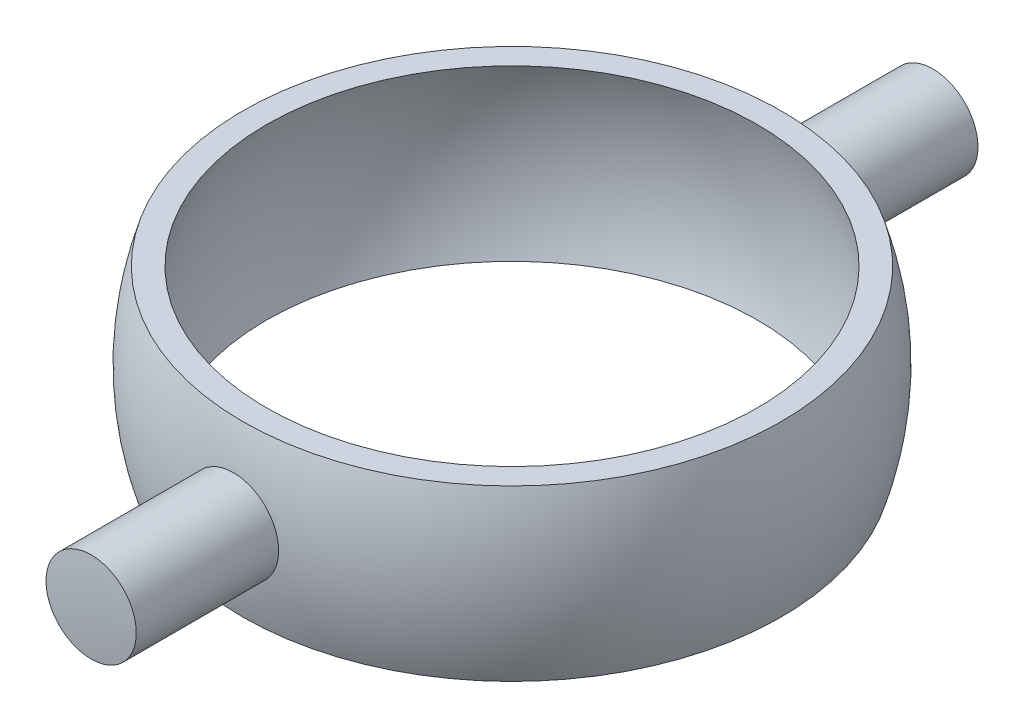
ISO-10303-21;
HEADER;
FILE_DESCRIPTION(('STEP AP214'),'2;1');
FILE_NAME('part.step','',(''),(''),'','','');
FILE_SCHEMA(('AUTOMOTIVE_DESIGN { 1 0 10303 214 1 1 1 1 }'));
ENDSEC;
DATA;
#1=APPLICATION_CONTEXT('core data for automotive mechanical design processes');
#2=APPLICATION_PROTOCOL_DEFINITION('international standard','automotive_design',2000,#1);
#3=PRODUCT_CONTEXT('',#1,'mechanical');
#4=PRODUCT('Part','Part','',(#3));
#5=PRODUCT_RELATED_PRODUCT_CATEGORY('part','',(#4));
#6=PRODUCT_DEFINITION_FORMATION('','',#4);
#7=PRODUCT_DEFINITION_CONTEXT('part definition',#1,'design');
#8=PRODUCT_DEFINITION('design','',#6,#7);
#9=PRODUCT_DEFINITION_SHAPE('','',#8);
#10=(LENGTH_UNIT() NAMED_UNIT(*) SI_UNIT(.MILLI.,.METRE.));
#11=(NAMED_UNIT(*) PLANE_ANGLE_UNIT() SI_UNIT($,.RADIAN.));
#12=(NAMED_UNIT(*) SI_UNIT($,.STERADIAN.) SOLID_ANGLE_UNIT());
#13=UNCERTAINTY_MEASURE_WITH_UNIT(LENGTH_MEASURE(1.E-05),#10,'distance_accuracy_value','');
#14=(GEOMETRIC_REPRESENTATION_CONTEXT(3) GLOBAL_UNCERTAINTY_ASSIGNED_CONTEXT((#13)) GLOBAL_UNIT_ASSIGNED_CONTEXT((#10,
#11,#12)) REPRESENTATION_CONTEXT('',''));
#15=CARTESIAN_POINT('',(0.,0.,0.));
#16=DIRECTION('',(0.,0.,1.));
#17=DIRECTION('',(1.,0.,0.));
#18=AXIS2_PLACEMENT_3D('',#15,#16,#17);
#19=CARTESIAN_POINT('',(0.,0.,0.));
#20=DIRECTION('',(0.,1.,0.));
#21=DIRECTION('',(-1.,0.,0.));
#22=AXIS2_PLACEMENT_3D('',#19,#20,#21);
#23=SPHERICAL_SURFACE('',#22,25.);
#24=CARTESIAN_POINT('',(0.,7.5,0.));
#25=DIRECTION('',(0.,1.,0.));
#26=DIRECTION('',(0.,0.,1.));
#27=AXIS2_PLACEMENT_3D('',#24,#25,#26);
#28=CIRCLE('',#27,23.8484800354236);
#29=CARTESIAN_POINT('',(0.,7.5,23.8484800354236));
#30=VERTEX_POINT('',#29);
#31=EDGE_CURVE('E62',#30,#30,#28,.T.);
#32=ORIENTED_EDGE('',*,*,#31,.F.);
#33=EDGE_LOOP('',(#32));
#34=FACE_BOUND('',#33,.T.);
#35=CARTESIAN_POINT('',(0.,-7.5,0.));
#36=DIRECTION('',(0.,1.,0.));
#37=DIRECTION('',(0.,0.,1.));
#38=AXIS2_PLACEMENT_3D('',#35,#36,#37);
#39=CIRCLE('',#38,23.8484800354236);
#40=CARTESIAN_POINT('',(0.,-7.5,23.8484800354236));
#41=VERTEX_POINT('',#40);
#42=EDGE_CURVE('E44',#41,#41,#39,.T.);
#43=ORIENTED_EDGE('',*,*,#42,.T.);
#44=EDGE_LOOP('',(#43));
#45=FACE_BOUND('',#44,.T.);
#46=CARTESIAN_POINT('',(0.,0.,24.6779253585061));
#47=DIRECTION('',(0.,0.,-1.));
#48=DIRECTION('',(-1.,0.,0.));
#49=AXIS2_PLACEMENT_3D('',#46,#47,#48);
#50=CIRCLE('',#49,4.);
#51=CARTESIAN_POINT('',(-4.,0.,24.6779253585061));
#52=VERTEX_POINT('',#51);
#53=EDGE_CURVE('E11',#52,#52,#50,.F.);
#54=ORIENTED_EDGE('',*,*,#53,.F.);
#55=EDGE_LOOP('',(#54));
#56=FACE_BOUND('',#55,.T.);
#57=CARTESIAN_POINT('',(0.,0.,-24.6779253585061));
#58=DIRECTION('',(0.,0.,1.));
#59=DIRECTION('',(1.,0.,0.));
#60=AXIS2_PLACEMENT_3D('',#57,#58,#59);
#61=CIRCLE('',#60,4.);
#62=CARTESIAN_POINT('',(4.,0.,-24.6779253585061));
#63=VERTEX_POINT('',#62);
#64=EDGE_CURVE('E59',#63,#63,#61,.F.);
#65=ORIENTED_EDGE('',*,*,#64,.F.);
#66=EDGE_LOOP('',(#65));
#67=FACE_BOUND('',#66,.T.);
#68=ADVANCED_FACE('F36',(#34,#45,#56,#67),#23,.T.);
#69=CARTESIAN_POINT('',(-23.8484800354236,-7.5,0.));
#70=DIRECTION('',(0.,-1.,0.));
#71=DIRECTION('',(0.,0.,-1.));
#72=AXIS2_PLACEMENT_3D('',#69,#70,#71);
#73=PLANE('',#72);
#74=CARTESIAN_POINT('',(0.,-7.49999999999999,0.));
#75=DIRECTION('',(0.,1.,0.));
#76=DIRECTION('',(0.,0.,1.));
#77=AXIS2_PLACEMENT_3D('',#74,#75,#76);
#78=CIRCLE('',#77,21.7428149051589);
#79=CARTESIAN_POINT('',(-21.7428149051589,-7.5,0.));
#80=VERTEX_POINT('',#79);
#81=EDGE_CURVE('E71',#80,#80,#78,.T.);
#82=ORIENTED_EDGE('',*,*,#81,.T.);
#83=EDGE_LOOP('',(#82));
#84=FACE_BOUND('',#83,.T.);
#85=ORIENTED_EDGE('',*,*,#42,.F.);
#86=EDGE_LOOP('',(#85));
#87=FACE_BOUND('',#86,.T.);
#88=ADVANCED_FACE('F79',(#84,#87),#73,.T.);
#89=CARTESIAN_POINT('',(0.,0.,0.));
#90=DIRECTION('',(0.,1.,0.));
#91=DIRECTION('',(-1.,0.,0.));
#92=AXIS2_PLACEMENT_3D('',#89,#90,#91);
#93=SPHERICAL_SURFACE('',#92,23.);
#94=CARTESIAN_POINT('',(0.,7.5,0.));
#95=DIRECTION('',(0.,1.,0.));
#96=DIRECTION('',(0.,0.,1.));
#97=AXIS2_PLACEMENT_3D('',#94,#95,#96);
#98=CIRCLE('',#97,21.7428149051589);
#99=CARTESIAN_POINT('',(-21.7428149051589,7.5,0.));
#100=VERTEX_POINT('',#99);
#101=EDGE_CURVE('E68',#100,#100,#98,.T.);
#102=CARTESIAN_POINT('',(-21.7428149051589,7.5,0.));
#103=CARTESIAN_POINT('',(-21.7947153524972,7.34953920797747,0.));
#104=CARTESIAN_POINT('',(-21.8450535321856,7.19853953467523,0.));
#105=CARTESIAN_POINT('',(-21.9425847312575,6.89552784524946,0.));
#106=CARTESIAN_POINT('',(-21.989777750641,6.74351582912592,0.));
#107=CARTESIAN_POINT('',(-22.080998004098,6.43854487379567,0.));
#108=CARTESIAN_POINT('',(-22.1250252381715,6.28558593458895,0.));
#109=CARTESIAN_POINT('',(-22.2098950235409,5.97878707782384,0.));
#110=CARTESIAN_POINT('',(-22.2507375748368,5.82494716026544,0.));
#111=CARTESIAN_POINT('',(-22.3292203723546,5.51645263987588,0.));
#112=CARTESIAN_POINT('',(-22.3668606185764,5.36179803704472,0.));
#113=CARTESIAN_POINT('',(-22.4389225898086,5.05174079868303,0.));
#114=CARTESIAN_POINT('',(-22.4733443148189,4.89633816315249,0.));
#115=CARTESIAN_POINT('',(-22.5389544075754,4.58485183209277,0.));
#116=CARTESIAN_POINT('',(-22.5701427753215,4.42876813656358,0.));
#117=CARTESIAN_POINT('',(-22.6292727128343,4.11598695232324,0.));
#118=CARTESIAN_POINT('',(-22.657214282601,3.95928946361209,0.));
#119=CARTESIAN_POINT('',(-22.7098385821962,3.64534822418676,0.));
#120=CARTESIAN_POINT('',(-22.7345213120247,3.48810447347257,0.));
#121=CARTESIAN_POINT('',(-22.7806172943665,3.17313847668344,0.));
#122=CARTESIAN_POINT('',(-22.8020305468798,3.01541623060848,0.));
#123=CARTESIAN_POINT('',(-22.8415783462106,2.69956121594348,0.));
#124=CARTESIAN_POINT('',(-22.859712893028,2.54142844735343,0.));
#125=CARTESIAN_POINT('',(-22.8926954656046,2.22482053742806,0.));
#126=CARTESIAN_POINT('',(-22.9075434913638,2.06634539609274,0.));
#127=CARTESIAN_POINT('',(-22.9339466228366,1.74912103799667,0.));
#128=CARTESIAN_POINT('',(-22.9455017285502,1.59037182123591,0.));
#129=CARTESIAN_POINT('',(-22.9653140400798,1.27266772772608,0.));
#130=CARTESIAN_POINT('',(-22.9735712458958,1.113712850977,0.));
#131=CARTESIAN_POINT('',(-22.9867841990593,0.795665941559934,0.));
#132=CARTESIAN_POINT('',(-22.9917399464068,0.63657390889195,0.));
#133=CARTESIAN_POINT('',(-22.9983478468772,0.318321250815977,0.));
#134=CARTESIAN_POINT('',(-23.,0.159160625407989,0.));
#135=CARTESIAN_POINT('',(-23.,-0.159160625407989,0.));
#136=CARTESIAN_POINT('',(-22.9983478468772,-0.318321250815977,0.));
#137=CARTESIAN_POINT('',(-22.9917399464068,-0.63657390889195,0.));
#138=CARTESIAN_POINT('',(-22.9867841990593,-0.795665941559934,0.));
#139=CARTESIAN_POINT('',(-22.9735712458958,-1.113712850977,0.));
#140=CARTESIAN_POINT('',(-22.9653140400798,-1.27266772772608,0.));
#141=CARTESIAN_POINT('',(-22.9455017285502,-1.59037182123591,0.));
#142=CARTESIAN_POINT('',(-22.9339466228366,-1.74912103799667,0.));
#143=CARTESIAN_POINT('',(-22.9075434913638,-2.06634539609275,0.));
#144=CARTESIAN_POINT('',(-22.8926954656046,-2.22482053742807,0.));
#145=CARTESIAN_POINT('',(-22.859712893028,-2.54142844735343,0.));
#146=CARTESIAN_POINT('',(-22.8415783462106,-2.69956121594348,0.));
#147=CARTESIAN_POINT('',(-22.8020305468798,-3.01541623060848,0.));
#148=CARTESIAN_POINT('',(-22.7806172943665,-3.17313847668343,0.));
#149=CARTESIAN_POINT('',(-22.7345213120247,-3.48810447347257,0.));
#150=CARTESIAN_POINT('',(-22.7098385821962,-3.64534822418676,0.));
#151=CARTESIAN_POINT('',(-22.657214282601,-3.95928946361209,0.));
#152=CARTESIAN_POINT('',(-22.6292727128343,-4.11598695232324,0.));
#153=CARTESIAN_POINT('',(-22.5701427753215,-4.42876813656358,0.));
#154=CARTESIAN_POINT('',(-22.5389544075754,-4.58485183209277,0.));
#155=CARTESIAN_POINT('',(-22.4733443148189,-4.89633816315249,0.));
#156=CARTESIAN_POINT('',(-22.4389225898086,-5.05174079868303,0.));
#157=CARTESIAN_POINT('',(-22.3668606185764,-5.36179803704472,0.));
#158=CARTESIAN_POINT('',(-22.3292203723546,-5.51645263987588,0.));
#159=CARTESIAN_POINT('',(-22.2507375748368,-5.82494716026544,0.));
#160=CARTESIAN_POINT('',(-22.2098950235409,-5.97878707782384,0.));
#161=CARTESIAN_POINT('',(-22.1250252381715,-6.28558593458895,0.));
#162=CARTESIAN_POINT('',(-22.080998004098,-6.43854487379567,0.));
#163=CARTESIAN_POINT('',(-21.989777750641,-6.74351582912592,0.));
#164=CARTESIAN_POINT('',(-21.9425847312575,-6.89552784524946,0.));
#165=CARTESIAN_POINT('',(-21.8450535321856,-7.19853953467523,0.));
#166=CARTESIAN_POINT('',(-21.7947153524972,-7.34953920797747,0.));
#167=CARTESIAN_POINT('',(-21.7428149051589,-7.5,0.));
#168=B_SPLINE_CURVE_WITH_KNOTS('',3,(#102,#103,#104,#105,#106,#107,#108,#109,#110,#111,#112,
#113,#114,#115,#116,#117,#118,#119,#120,#121,#122,#123,#124,#125,#126,#127,#128,#129,#130,#131,
#132,#133,#134,#135,#136,#137,#138,#139,#140,#141,#142,#143,#144,#145,#146,#147,#148,#149,#150,
#151,#152,#153,#154,#155,#156,#157,#158,#159,#160,#161,#162,#163,#164,#165,#166,#167),
.UNSPECIFIED.,.F.,.F.,(4,2,2,2,2,2,2,2,2,2,2,2,2,2,2,2,2,2,2,2,2,2,2,2,2,2,2,2,2,2,2,2,4),(0.,
0.477473302362448,0.954946604724896,1.43241990708734,1.90989320944979,2.38736651181224,
2.86483981417469,3.34231311653714,3.81978641889958,4.29725972126203,4.77473302362448,
5.25220632598693,5.72967962834938,6.20715293071183,6.68462623307427,7.16209953543672,
7.63957283779917,8.11704614016162,8.59451944252407,9.07199274488651,9.54946604724896,
10.0269393496114,10.5044126519739,10.9818859543363,11.4593592566988,11.9368325590612,
12.4143058614237,12.8917791637861,13.3692524661485,13.846725768511,14.3241990708734,
14.8016723732359,15.2791456755983),.UNSPECIFIED.);
#169=EDGE_CURVE('BSEAM81',#100,#80,#168,.T.);
#170=ORIENTED_EDGE('',*,*,#101,.T.);
#171=ORIENTED_EDGE('',*,*,#81,.F.);
#172=ORIENTED_EDGE('',*,*,#169,.T.);
#173=ORIENTED_EDGE('',*,*,#169,.F.);
#174=EDGE_LOOP('',(#170,#172,#171,#173));
#175=FACE_BOUND('',#174,.T.);
#176=ADVANCED_FACE('F81',(#175),#93,.F.);
#177=CARTESIAN_POINT('',(-23.8484800354236,7.5,0.));
#178=DIRECTION('',(0.,1.,0.));
#179=DIRECTION('',(0.,0.,1.));
#180=AXIS2_PLACEMENT_3D('',#177,#178,#179);
#181=PLANE('',#180);
#182=ORIENTED_EDGE('',*,*,#31,.T.);
#183=EDGE_LOOP('',(#182));
#184=FACE_BOUND('',#183,.T.);
#185=ORIENTED_EDGE('',*,*,#101,.F.);
#186=EDGE_LOOP('',(#185));
#187=FACE_BOUND('',#186,.T.);
#188=ADVANCED_FACE('F87',(#184,#187),#181,.T.);
#189=CARTESIAN_POINT('',(0.,0.,-25.001));
#190=DIRECTION('',(0.,0.,1.));
#191=DIRECTION('',(1.,0.,0.));
#192=AXIS2_PLACEMENT_3D('',#189,#190,#191);
#193=CYLINDRICAL_SURFACE('',#192,4.);
#194=CARTESIAN_POINT('',(0.,0.,37.2860563750043));
#195=DIRECTION('',(0.,0.,-1.));
#196=DIRECTION('',(-1.,0.,0.));
#197=AXIS2_PLACEMENT_3D('',#194,#195,#196);
#198=CIRCLE('',#197,4.);
#199=CARTESIAN_POINT('',(-4.,0.,37.2860563750043));
#200=VERTEX_POINT('',#199);
#201=EDGE_CURVE('E57',#200,#200,#198,.F.);
#202=ORIENTED_EDGE('',*,*,#201,.F.);
#203=EDGE_LOOP('',(#202));
#204=FACE_BOUND('',#203,.T.);
#205=ORIENTED_EDGE('',*,*,#53,.T.);
#206=EDGE_LOOP('',(#205));
#207=FACE_BOUND('',#206,.T.);
#208=ADVANCED_FACE('F94',(#204,#207),#193,.T.);
#209=CARTESIAN_POINT('',(0.,0.,37.501));
#210=DIRECTION('',(0.,0.,-1.));
#211=DIRECTION('',(-1.,0.,0.));
#212=AXIS2_PLACEMENT_3D('',#209,#210,#211);
#213=CYLINDRICAL_SURFACE('',#212,4.);
#214=CARTESIAN_POINT('',(0.,0.,-37.2860563750043));
#215=DIRECTION('',(0.,0.,1.));
#216=DIRECTION('',(1.,0.,0.));
#217=AXIS2_PLACEMENT_3D('',#214,#215,#216);
#218=CIRCLE('',#217,4.);
#219=CARTESIAN_POINT('',(4.,0.,-37.2860563750043));
#220=VERTEX_POINT('',#219);
#221=EDGE_CURVE('E39',#220,#220,#218,.T.);
#222=ORIENTED_EDGE('',*,*,#221,.T.);
#223=EDGE_LOOP('',(#222));
#224=FACE_BOUND('',#223,.T.);
#225=ORIENTED_EDGE('',*,*,#64,.T.);
#226=EDGE_LOOP('',(#225));
#227=FACE_BOUND('',#226,.T.);
#228=ADVANCED_FACE('F98',(#224,#227),#213,.T.);
#229=CARTESIAN_POINT('',(0.,0.,0.));
#230=DIRECTION('',(0.,1.,0.));
#231=DIRECTION('',(0.,0.,1.));
#232=AXIS2_PLACEMENT_3D('',#229,#230,#231);
#233=SPHERICAL_SURFACE('',#232,37.5);
#234=CARTESIAN_POINT('',(0.,0.,-37.5));
#235=VERTEX_POINT('',#234);
#236=VERTEX_LOOP('',#235);
#237=FACE_BOUND('',#236,.T.);
#238=ORIENTED_EDGE('',*,*,#221,.F.);
#239=EDGE_LOOP('',(#238));
#240=FACE_BOUND('',#239,.T.);
#241=ADVANCED_FACE('F53',(#237,#240),#233,.T.);
#242=CARTESIAN_POINT('',(0.,0.,37.5));
#243=VERTEX_POINT('',#242);
#244=VERTEX_LOOP('',#243);
#245=FACE_BOUND('',#244,.T.);
#246=ORIENTED_EDGE('',*,*,#201,.T.);
#247=EDGE_LOOP('',(#246));
#248=FACE_BOUND('',#247,.T.);
#249=ADVANCED_FACE('F50',(#245,#248),#233,.T.);
#250=CLOSED_SHELL('',(#68,#88,#176,#188,#208,#228,#241,#249));
#251=MANIFOLD_SOLID_BREP('B2',#250);
#252=ADVANCED_BREP_SHAPE_REPRESENTATION('',(#18,#251),#14);
#253=SHAPE_DEFINITION_REPRESENTATION(#9,#252);
ENDSEC;
END-ISO-10303-21;
